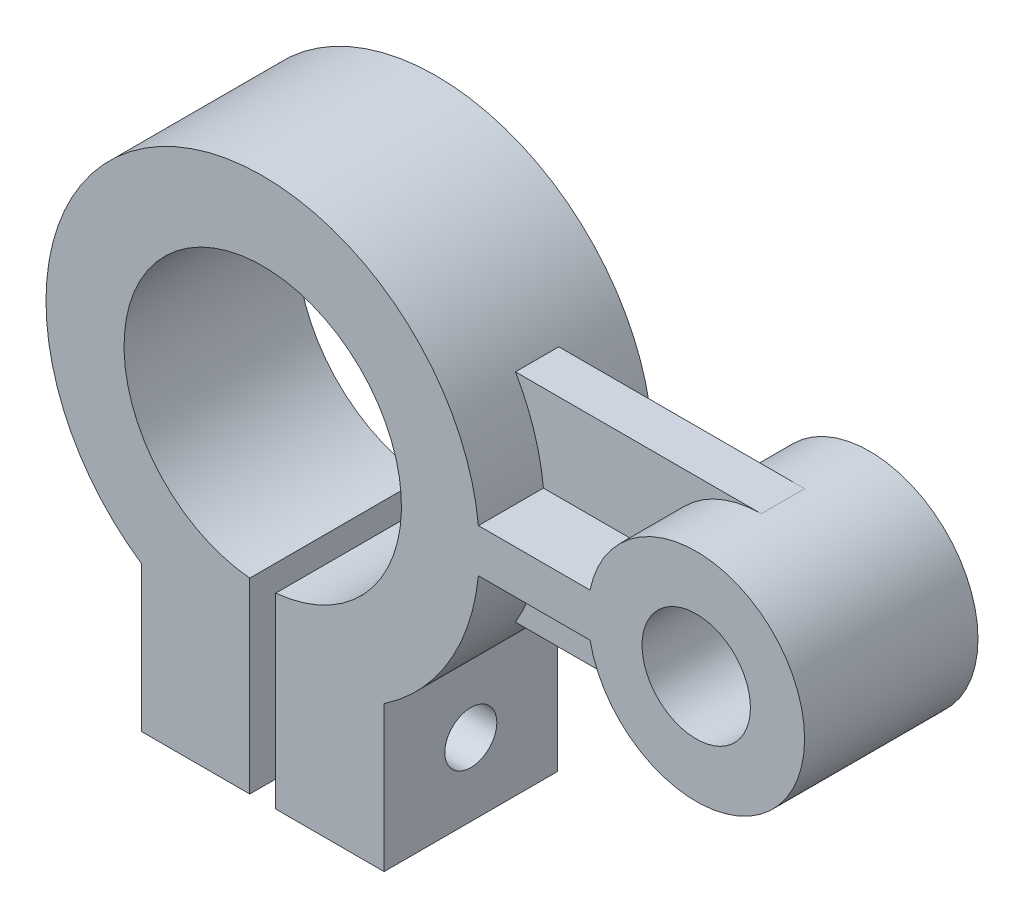
ISO-10303-21;
HEADER;
FILE_DESCRIPTION(('STEP AP214'),'2;1');
FILE_NAME('part.step','',(''),(''),'','','');
FILE_SCHEMA(('AUTOMOTIVE_DESIGN { 1 0 10303 214 1 1 1 1 }'));
ENDSEC;
DATA;
#1=APPLICATION_CONTEXT('core data for automotive mechanical design processes');
#2=APPLICATION_PROTOCOL_DEFINITION('international standard','automotive_design',2000,#1);
#3=PRODUCT_CONTEXT('',#1,'mechanical');
#4=PRODUCT('Part','Part','',(#3));
#5=PRODUCT_RELATED_PRODUCT_CATEGORY('part','',(#4));
#6=PRODUCT_DEFINITION_FORMATION('','',#4);
#7=PRODUCT_DEFINITION_CONTEXT('part definition',#1,'design');
#8=PRODUCT_DEFINITION('design','',#6,#7);
#9=PRODUCT_DEFINITION_SHAPE('','',#8);
#10=(LENGTH_UNIT() NAMED_UNIT(*) SI_UNIT(.MILLI.,.METRE.));
#11=(NAMED_UNIT(*) PLANE_ANGLE_UNIT() SI_UNIT($,.RADIAN.));
#12=(NAMED_UNIT(*) SI_UNIT($,.STERADIAN.) SOLID_ANGLE_UNIT());
#13=UNCERTAINTY_MEASURE_WITH_UNIT(LENGTH_MEASURE(1.E-05),#10,'distance_accuracy_value','');
#14=(GEOMETRIC_REPRESENTATION_CONTEXT(3) GLOBAL_UNCERTAINTY_ASSIGNED_CONTEXT((#13)) GLOBAL_UNIT_ASSIGNED_CONTEXT((#10,
#11,#12)) REPRESENTATION_CONTEXT('',''));
#15=CARTESIAN_POINT('',(0.,0.,0.));
#16=DIRECTION('',(0.,0.,1.));
#17=DIRECTION('',(1.,0.,0.));
#18=AXIS2_PLACEMENT_3D('',#15,#16,#17);
#19=CARTESIAN_POINT('',(-15.6317467532963,30.4345278718711,20.));
#20=DIRECTION('',(0.,1.,0.));
#21=DIRECTION('',(0.,0.,1.));
#22=AXIS2_PLACEMENT_3D('',#19,#20,#21);
#23=PLANE('',#22);
#24=DIRECTION('',(1.,0.,0.));
#25=VECTOR('',#24,1.);
#26=CARTESIAN_POINT('',(0.,30.4345278718711,-5.));
#27=LINE('',#26,#25);
#28=CARTESIAN_POINT('',(-15.6317467532963,30.4345278718711,-5.));
#29=VERTEX_POINT('',#28);
#30=CARTESIAN_POINT('',(10.1239839635409,30.4345278718711,-5.));
#31=VERTEX_POINT('',#30);
#32=EDGE_CURVE('E172',#29,#31,#27,.T.);
#33=ORIENTED_EDGE('',*,*,#32,.F.);
#34=DIRECTION('',(0.,0.,-1.));
#35=VECTOR('',#34,1.);
#36=CARTESIAN_POINT('',(-15.6317467532963,30.4345278718711,20.));
#37=LINE('',#36,#35);
#38=CARTESIAN_POINT('',(-15.6317467532963,30.4345278718711,-20.));
#39=VERTEX_POINT('',#38);
#40=EDGE_CURVE('E315',#29,#39,#37,.T.);
#41=ORIENTED_EDGE('',*,*,#40,.T.);
#42=DIRECTION('',(1.,0.,0.));
#43=VECTOR('',#42,1.);
#44=CARTESIAN_POINT('',(-15.6317467532963,30.4345278718711,-20.));
#45=LINE('',#44,#43);
#46=CARTESIAN_POINT('',(10.1239839635409,30.4345278718711,-20.));
#47=VERTEX_POINT('',#46);
#48=EDGE_CURVE('E175',#39,#47,#45,.T.);
#49=ORIENTED_EDGE('',*,*,#48,.T.);
#50=DIRECTION('',(0.,0.,-1.));
#51=VECTOR('',#50,1.);
#52=CARTESIAN_POINT('',(10.1239839635409,30.4345278718711,20.));
#53=LINE('',#52,#51);
#54=EDGE_CURVE('E170',#31,#47,#53,.T.);
#55=ORIENTED_EDGE('',*,*,#54,.F.);
#56=EDGE_LOOP('',(#33,#41,#49,#55));
#57=FACE_BOUND('',#56,.T.);
#58=ADVANCED_FACE('F34',(#57),#23,.F.);
#59=CARTESIAN_POINT('',(34.6188813913727,35.4345278718711,20.));
#60=DIRECTION('',(0.,0.,-1.));
#61=DIRECTION('',(-1.,0.,0.));
#62=AXIS2_PLACEMENT_3D('',#59,#60,#61);
#63=CYLINDRICAL_SURFACE('',#62,25.);
#64=CARTESIAN_POINT('',(10.1239839635409,30.4345278718711,20.));
#65=VERTEX_POINT('',#64);
#66=CARTESIAN_POINT('',(10.1239839635409,30.4345278718711,5.));
#67=VERTEX_POINT('',#66);
#68=EDGE_CURVE('E178',#65,#67,#53,.T.);
#69=ORIENTED_EDGE('',*,*,#68,.T.);
#70=CARTESIAN_POINT('',(34.6188813913727,35.4345278718711,5.));
#71=DIRECTION('',(0.,0.,1.));
#72=DIRECTION('',(1.,0.,0.));
#73=AXIS2_PLACEMENT_3D('',#70,#71,#72);
#74=CIRCLE('',#73,25.);
#75=CARTESIAN_POINT('',(34.6188813913727,10.4345278718711,5.));
#76=VERTEX_POINT('',#75);
#77=EDGE_CURVE('E49',#67,#76,#74,.T.);
#78=ORIENTED_EDGE('',*,*,#77,.T.);
#79=DIRECTION('',(0.,0.,-1.));
#80=VECTOR('',#79,1.);
#81=CARTESIAN_POINT('',(34.6188813913726,10.4345278718711,5.));
#82=LINE('',#81,#80);
#83=CARTESIAN_POINT('',(34.6188813913726,10.4345278718711,-5.));
#84=VERTEX_POINT('',#83);
#85=EDGE_CURVE('E53',#76,#84,#82,.T.);
#86=ORIENTED_EDGE('',*,*,#85,.T.);
#87=CARTESIAN_POINT('',(34.6188813913727,35.4345278718711,-5.));
#88=DIRECTION('',(0.,0.,1.));
#89=DIRECTION('',(1.,0.,0.));
#90=AXIS2_PLACEMENT_3D('',#87,#88,#89);
#91=CIRCLE('',#90,25.);
#92=EDGE_CURVE('E182',#31,#84,#91,.T.);
#93=ORIENTED_EDGE('',*,*,#92,.F.);
#94=ORIENTED_EDGE('',*,*,#54,.T.);
#95=CARTESIAN_POINT('',(34.6188813913727,35.4345278718711,-20.));
#96=DIRECTION('',(0.,0.,1.));
#97=DIRECTION('',(1.,0.,0.));
#98=AXIS2_PLACEMENT_3D('',#95,#96,#97);
#99=CIRCLE('',#98,25.);
#100=CARTESIAN_POINT('',(10.1239839635409,40.4345278718711,-20.));
#101=VERTEX_POINT('',#100);
#102=EDGE_CURVE('E295',#47,#101,#99,.T.);
#103=ORIENTED_EDGE('',*,*,#102,.T.);
#104=DIRECTION('',(0.,0.,-1.));
#105=VECTOR('',#104,1.);
#106=CARTESIAN_POINT('',(10.1239839635409,40.4345278718711,20.));
#107=LINE('',#106,#105);
#108=CARTESIAN_POINT('',(10.1239839635409,40.4345278718711,-5.));
#109=VERTEX_POINT('',#108);
#110=EDGE_CURVE('E312',#109,#101,#107,.T.);
#111=ORIENTED_EDGE('',*,*,#110,.F.);
#112=CARTESIAN_POINT('',(34.6188813913727,35.4345278718711,-5.));
#113=DIRECTION('',(0.,0.,1.));
#114=DIRECTION('',(1.,0.,0.));
#115=AXIS2_PLACEMENT_3D('',#112,#113,#114);
#116=CIRCLE('',#115,25.);
#117=CARTESIAN_POINT('',(34.6188813913726,60.4345278718711,-5.));
#118=VERTEX_POINT('',#117);
#119=EDGE_CURVE('E222',#118,#109,#116,.T.);
#120=ORIENTED_EDGE('',*,*,#119,.F.);
#121=DIRECTION('',(0.,0.,1.));
#122=VECTOR('',#121,1.);
#123=CARTESIAN_POINT('',(34.6188813913726,60.4345278718711,-5.));
#124=LINE('',#123,#122);
#125=CARTESIAN_POINT('',(34.6188813913726,60.4345278718711,5.));
#126=VERTEX_POINT('',#125);
#127=EDGE_CURVE('E227',#118,#126,#124,.T.);
#128=ORIENTED_EDGE('',*,*,#127,.T.);
#129=CARTESIAN_POINT('',(34.6188813913727,35.4345278718711,5.));
#130=DIRECTION('',(0.,0.,1.));
#131=DIRECTION('',(1.,0.,0.));
#132=AXIS2_PLACEMENT_3D('',#129,#130,#131);
#133=CIRCLE('',#132,25.);
#134=CARTESIAN_POINT('',(10.1239839635409,40.4345278718711,5.));
#135=VERTEX_POINT('',#134);
#136=EDGE_CURVE('E213',#126,#135,#133,.T.);
#137=ORIENTED_EDGE('',*,*,#136,.T.);
#138=CARTESIAN_POINT('',(10.1239839635409,40.4345278718711,20.));
#139=VERTEX_POINT('',#138);
#140=EDGE_CURVE('E179',#139,#135,#107,.T.);
#141=ORIENTED_EDGE('',*,*,#140,.F.);
#142=CARTESIAN_POINT('',(34.6188813913727,35.4345278718711,20.));
#143=DIRECTION('',(0.,0.,1.));
#144=DIRECTION('',(1.,0.,0.));
#145=AXIS2_PLACEMENT_3D('',#142,#143,#144);
#146=CIRCLE('',#145,25.);
#147=EDGE_CURVE('E270',#65,#139,#146,.T.);
#148=ORIENTED_EDGE('',*,*,#147,.F.);
#149=EDGE_LOOP('',(#69,#78,#86,#93,#94,#103,#111,#120,#128,#137,#141,#148));
#150=FACE_BOUND('',#149,.T.);
#151=ADVANCED_FACE('F183',(#150),#63,.T.);
#152=CARTESIAN_POINT('',(-15.6317467532963,40.4345278718711,20.));
#153=DIRECTION('',(0.,-1.,0.));
#154=DIRECTION('',(0.,0.,-1.));
#155=AXIS2_PLACEMENT_3D('',#152,#153,#154);
#156=PLANE('',#155);
#157=DIRECTION('',(-1.,0.,0.));
#158=VECTOR('',#157,1.);
#159=CARTESIAN_POINT('',(0.,40.4345278718711,-5.));
#160=LINE('',#159,#158);
#161=CARTESIAN_POINT('',(-15.6317467532963,40.4345278718711,-5.));
#162=VERTEX_POINT('',#161);
#163=EDGE_CURVE('E220',#109,#162,#160,.T.);
#164=ORIENTED_EDGE('',*,*,#163,.F.);
#165=ORIENTED_EDGE('',*,*,#110,.T.);
#166=DIRECTION('',(-1.,0.,0.));
#167=VECTOR('',#166,1.);
#168=CARTESIAN_POINT('',(-15.6317467532963,40.4345278718711,-20.));
#169=LINE('',#168,#167);
#170=CARTESIAN_POINT('',(-15.6317467532963,40.4345278718711,-20.));
#171=VERTEX_POINT('',#170);
#172=EDGE_CURVE('E297',#101,#171,#169,.T.);
#173=ORIENTED_EDGE('',*,*,#172,.T.);
#174=DIRECTION('',(0.,0.,-1.));
#175=VECTOR('',#174,1.);
#176=CARTESIAN_POINT('',(-15.6317467532963,40.4345278718711,20.));
#177=LINE('',#176,#175);
#178=EDGE_CURVE('E308',#162,#171,#177,.T.);
#179=ORIENTED_EDGE('',*,*,#178,.F.);
#180=EDGE_LOOP('',(#164,#165,#173,#179));
#181=FACE_BOUND('',#180,.T.);
#182=ADVANCED_FACE('F378',(#181),#156,.F.);
#183=CARTESIAN_POINT('',(-65.3811186086273,35.4345278718711,20.));
#184=DIRECTION('',(0.,0.,-1.));
#185=DIRECTION('',(-1.,0.,0.));
#186=AXIS2_PLACEMENT_3D('',#183,#184,#185);
#187=CYLINDRICAL_SURFACE('',#186,50.);
#188=CARTESIAN_POINT('',(-65.3811186086273,35.4345278718711,-5.));
#189=DIRECTION('',(0.,0.,1.));
#190=DIRECTION('',(1.,0.,0.));
#191=AXIS2_PLACEMENT_3D('',#188,#189,#190);
#192=CIRCLE('',#191,50.);
#193=CARTESIAN_POINT('',(-22.0798484194053,60.4345278718711,-5.));
#194=VERTEX_POINT('',#193);
#195=EDGE_CURVE('E218',#162,#194,#192,.T.);
#196=ORIENTED_EDGE('',*,*,#195,.F.);
#197=ORIENTED_EDGE('',*,*,#178,.T.);
#198=CARTESIAN_POINT('',(-65.3811186086273,35.4345278718711,-20.));
#199=DIRECTION('',(0.,0.,1.));
#200=DIRECTION('',(1.,0.,0.));
#201=AXIS2_PLACEMENT_3D('',#198,#199,#200);
#202=CIRCLE('',#201,50.);
#203=CARTESIAN_POINT('',(-93.3811186086273,-5.9901024825449,-20.));
#204=VERTEX_POINT('',#203);
#205=EDGE_CURVE('E300',#171,#204,#202,.T.);
#206=ORIENTED_EDGE('',*,*,#205,.T.);
#207=DIRECTION('',(0.,0.,-1.));
#208=VECTOR('',#207,1.);
#209=CARTESIAN_POINT('',(-93.3811186086273,-5.9901024825449,20.));
#210=LINE('',#209,#208);
#211=CARTESIAN_POINT('',(-93.3811186086273,-5.9901024825449,20.));
#212=VERTEX_POINT('',#211);
#213=EDGE_CURVE('E305',#212,#204,#210,.T.);
#214=ORIENTED_EDGE('',*,*,#213,.F.);
#215=CARTESIAN_POINT('',(-65.3811186086273,35.4345278718711,20.));
#216=DIRECTION('',(0.,0.,1.));
#217=DIRECTION('',(1.,0.,0.));
#218=AXIS2_PLACEMENT_3D('',#215,#216,#217);
#219=CIRCLE('',#218,50.);
#220=CARTESIAN_POINT('',(-15.6317467532963,40.4345278718711,20.));
#221=VERTEX_POINT('',#220);
#222=EDGE_CURVE('E274',#221,#212,#219,.T.);
#223=ORIENTED_EDGE('',*,*,#222,.F.);
#224=CARTESIAN_POINT('',(-15.6317467532963,40.4345278718711,5.));
#225=VERTEX_POINT('',#224);
#226=EDGE_CURVE('E309',#221,#225,#177,.T.);
#227=ORIENTED_EDGE('',*,*,#226,.T.);
#228=CARTESIAN_POINT('',(-65.3811186086273,35.4345278718711,5.));
#229=DIRECTION('',(0.,0.,1.));
#230=DIRECTION('',(1.,0.,0.));
#231=AXIS2_PLACEMENT_3D('',#228,#229,#230);
#232=CIRCLE('',#231,50.);
#233=CARTESIAN_POINT('',(-22.0798484194053,60.4345278718711,5.));
#234=VERTEX_POINT('',#233);
#235=EDGE_CURVE('E207',#225,#234,#232,.T.);
#236=ORIENTED_EDGE('',*,*,#235,.T.);
#237=DIRECTION('',(0.,0.,1.));
#238=VECTOR('',#237,1.);
#239=CARTESIAN_POINT('',(-22.0798484194053,60.4345278718711,-5.));
#240=LINE('',#239,#238);
#241=EDGE_CURVE('E228',#194,#234,#240,.T.);
#242=ORIENTED_EDGE('',*,*,#241,.F.);
#243=EDGE_LOOP('',(#196,#197,#206,#214,#223,#227,#236,#242));
#244=FACE_BOUND('',#243,.T.);
#245=ADVANCED_FACE('F373',(#244),#187,.T.);
#246=CARTESIAN_POINT('',(-65.3811186086273,35.4345278718711,20.));
#247=DIRECTION('',(0.,0.,1.));
#248=DIRECTION('',(1.,0.,0.));
#249=AXIS2_PLACEMENT_3D('',#246,#247,#248);
#250=PLANE('',#249);
#251=DIRECTION('',(1.,0.,0.));
#252=VECTOR('',#251,1.);
#253=CARTESIAN_POINT('',(-68.3811186086273,-39.5654721281289,20.));
#254=LINE('',#253,#252);
#255=CARTESIAN_POINT('',(-93.3811186086273,-39.5654721281289,20.));
#256=VERTEX_POINT('',#255);
#257=CARTESIAN_POINT('',(-68.3811186086273,-39.5654721281289,20.));
#258=VERTEX_POINT('',#257);
#259=EDGE_CURVE('E252',#256,#258,#254,.T.);
#260=ORIENTED_EDGE('',*,*,#259,.T.);
#261=DIRECTION('',(0.,1.,0.));
#262=VECTOR('',#261,1.);
#263=CARTESIAN_POINT('',(-68.3811186086273,-39.5654721281289,20.));
#264=LINE('',#263,#262);
#265=CARTESIAN_POINT('',(-68.3811186086273,3.57546322772308,20.));
#266=VERTEX_POINT('',#265);
#267=EDGE_CURVE('E255',#258,#266,#264,.T.);
#268=ORIENTED_EDGE('',*,*,#267,.T.);
#269=CARTESIAN_POINT('',(-65.3811186086273,35.4345278718711,20.));
#270=DIRECTION('',(0.,0.,-1.));
#271=DIRECTION('',(1.,0.,0.));
#272=AXIS2_PLACEMENT_3D('',#269,#270,#271);
#273=CIRCLE('',#272,32.);
#274=CARTESIAN_POINT('',(-62.3811186086273,3.57546322772308,20.));
#275=VERTEX_POINT('',#274);
#276=EDGE_CURVE('E258',#266,#275,#273,.T.);
#277=ORIENTED_EDGE('',*,*,#276,.T.);
#278=DIRECTION('',(0.,-1.,0.));
#279=VECTOR('',#278,1.);
#280=CARTESIAN_POINT('',(-62.3811186086273,-39.5654721281289,20.));
#281=LINE('',#280,#279);
#282=CARTESIAN_POINT('',(-62.3811186086273,-39.5654721281289,20.));
#283=VERTEX_POINT('',#282);
#284=EDGE_CURVE('E260',#275,#283,#281,.T.);
#285=ORIENTED_EDGE('',*,*,#284,.T.);
#286=DIRECTION('',(1.,0.,0.));
#287=VECTOR('',#286,1.);
#288=CARTESIAN_POINT('',(-62.3811186086273,-39.5654721281289,20.));
#289=LINE('',#288,#287);
#290=CARTESIAN_POINT('',(-37.3811186086273,-39.5654721281289,20.));
#291=VERTEX_POINT('',#290);
#292=EDGE_CURVE('E262',#283,#291,#289,.T.);
#293=ORIENTED_EDGE('',*,*,#292,.T.);
#294=DIRECTION('',(0.,1.,0.));
#295=VECTOR('',#294,1.);
#296=CARTESIAN_POINT('',(-37.3811186086273,-39.5654721281289,20.));
#297=LINE('',#296,#295);
#298=CARTESIAN_POINT('',(-37.3811186086273,-5.99010248254489,20.));
#299=VERTEX_POINT('',#298);
#300=EDGE_CURVE('E264',#291,#299,#297,.T.);
#301=ORIENTED_EDGE('',*,*,#300,.T.);
#302=CARTESIAN_POINT('',(-65.3811186086273,35.4345278718711,20.));
#303=DIRECTION('',(0.,0.,1.));
#304=DIRECTION('',(1.,0.,0.));
#305=AXIS2_PLACEMENT_3D('',#302,#303,#304);
#306=CIRCLE('',#305,50.);
#307=CARTESIAN_POINT('',(-15.6317467532963,30.4345278718711,20.));
#308=VERTEX_POINT('',#307);
#309=EDGE_CURVE('E266',#299,#308,#306,.T.);
#310=ORIENTED_EDGE('',*,*,#309,.T.);
#311=DIRECTION('',(1.,0.,0.));
#312=VECTOR('',#311,1.);
#313=CARTESIAN_POINT('',(-15.6317467532963,30.4345278718711,20.));
#314=LINE('',#313,#312);
#315=EDGE_CURVE('E268',#308,#65,#314,.T.);
#316=ORIENTED_EDGE('',*,*,#315,.T.);
#317=ORIENTED_EDGE('',*,*,#147,.T.);
#318=DIRECTION('',(-1.,0.,0.));
#319=VECTOR('',#318,1.);
#320=CARTESIAN_POINT('',(-15.6317467532963,40.4345278718711,20.));
#321=LINE('',#320,#319);
#322=EDGE_CURVE('E272',#139,#221,#321,.T.);
#323=ORIENTED_EDGE('',*,*,#322,.T.);
#324=ORIENTED_EDGE('',*,*,#222,.T.);
#325=DIRECTION('',(0.,-1.,0.));
#326=VECTOR('',#325,1.);
#327=CARTESIAN_POINT('',(-93.3811186086273,-39.5654721281289,20.));
#328=LINE('',#327,#326);
#329=EDGE_CURVE('E276',#212,#256,#328,.T.);
#330=ORIENTED_EDGE('',*,*,#329,.T.);
#331=EDGE_LOOP('',(#260,#268,#277,#285,#293,#301,#310,#316,#317,#323,#324,#330));
#332=FACE_BOUND('',#331,.T.);
#333=CARTESIAN_POINT('',(34.6188813913727,35.4345278718711,20.));
#334=DIRECTION('',(0.,0.,1.));
#335=DIRECTION('',(1.,0.,0.));
#336=AXIS2_PLACEMENT_3D('',#333,#334,#335);
#337=CIRCLE('',#336,12.5);
#338=CARTESIAN_POINT('',(47.1188813913727,35.4345278718711,20.));
#339=VERTEX_POINT('',#338);
#340=EDGE_CURVE('E246',#339,#339,#337,.T.);
#341=ORIENTED_EDGE('',*,*,#340,.F.);
#342=EDGE_LOOP('',(#341));
#343=FACE_BOUND('',#342,.T.);
#344=ADVANCED_FACE('F355',(#332,#343),#250,.T.);
#345=CARTESIAN_POINT('',(-65.3811186086273,35.4345278718711,-20.));
#346=DIRECTION('',(0.,0.,1.));
#347=DIRECTION('',(1.,0.,0.));
#348=AXIS2_PLACEMENT_3D('',#345,#346,#347);
#349=PLANE('',#348);
#350=DIRECTION('',(1.,0.,0.));
#351=VECTOR('',#350,1.);
#352=CARTESIAN_POINT('',(-68.3811186086273,-39.5654721281289,-20.));
#353=LINE('',#352,#351);
#354=CARTESIAN_POINT('',(-93.3811186086273,-39.5654721281289,-20.));
#355=VERTEX_POINT('',#354);
#356=CARTESIAN_POINT('',(-68.3811186086273,-39.5654721281289,-20.));
#357=VERTEX_POINT('',#356);
#358=EDGE_CURVE('E249',#355,#357,#353,.T.);
#359=ORIENTED_EDGE('',*,*,#358,.F.);
#360=DIRECTION('',(0.,-1.,0.));
#361=VECTOR('',#360,1.);
#362=CARTESIAN_POINT('',(-93.3811186086273,-39.5654721281289,-20.));
#363=LINE('',#362,#361);
#364=EDGE_CURVE('E256',#204,#355,#363,.T.);
#365=ORIENTED_EDGE('',*,*,#364,.F.);
#366=ORIENTED_EDGE('',*,*,#205,.F.);
#367=ORIENTED_EDGE('',*,*,#172,.F.);
#368=ORIENTED_EDGE('',*,*,#102,.F.);
#369=ORIENTED_EDGE('',*,*,#48,.F.);
#370=CARTESIAN_POINT('',(-65.3811186086273,35.4345278718711,-20.));
#371=DIRECTION('',(0.,0.,1.));
#372=DIRECTION('',(1.,0.,0.));
#373=AXIS2_PLACEMENT_3D('',#370,#371,#372);
#374=CIRCLE('',#373,50.);
#375=CARTESIAN_POINT('',(-37.3811186086273,-5.99010248254489,-20.));
#376=VERTEX_POINT('',#375);
#377=EDGE_CURVE('E291',#376,#39,#374,.T.);
#378=ORIENTED_EDGE('',*,*,#377,.F.);
#379=DIRECTION('',(0.,1.,0.));
#380=VECTOR('',#379,1.);
#381=CARTESIAN_POINT('',(-37.3811186086273,-39.5654721281289,-20.));
#382=LINE('',#381,#380);
#383=CARTESIAN_POINT('',(-37.3811186086273,-39.5654721281289,-20.));
#384=VERTEX_POINT('',#383);
#385=EDGE_CURVE('E289',#384,#376,#382,.T.);
#386=ORIENTED_EDGE('',*,*,#385,.F.);
#387=DIRECTION('',(1.,0.,0.));
#388=VECTOR('',#387,1.);
#389=CARTESIAN_POINT('',(-62.3811186086273,-39.5654721281289,-20.));
#390=LINE('',#389,#388);
#391=CARTESIAN_POINT('',(-62.3811186086273,-39.5654721281289,-20.));
#392=VERTEX_POINT('',#391);
#393=EDGE_CURVE('E287',#392,#384,#390,.T.);
#394=ORIENTED_EDGE('',*,*,#393,.F.);
#395=DIRECTION('',(0.,-1.,0.));
#396=VECTOR('',#395,1.);
#397=CARTESIAN_POINT('',(-62.3811186086273,-39.5654721281289,-20.));
#398=LINE('',#397,#396);
#399=CARTESIAN_POINT('',(-62.3811186086273,3.57546322772308,-20.));
#400=VERTEX_POINT('',#399);
#401=EDGE_CURVE('E285',#400,#392,#398,.T.);
#402=ORIENTED_EDGE('',*,*,#401,.F.);
#403=CARTESIAN_POINT('',(-65.3811186086273,35.4345278718711,-20.));
#404=DIRECTION('',(0.,0.,-1.));
#405=DIRECTION('',(1.,0.,0.));
#406=AXIS2_PLACEMENT_3D('',#403,#404,#405);
#407=CIRCLE('',#406,32.);
#408=CARTESIAN_POINT('',(-68.3811186086273,3.57546322772308,-20.));
#409=VERTEX_POINT('',#408);
#410=EDGE_CURVE('E283',#409,#400,#407,.T.);
#411=ORIENTED_EDGE('',*,*,#410,.F.);
#412=DIRECTION('',(0.,1.,0.));
#413=VECTOR('',#412,1.);
#414=CARTESIAN_POINT('',(-68.3811186086273,-39.5654721281289,-20.));
#415=LINE('',#414,#413);
#416=EDGE_CURVE('E281',#357,#409,#415,.T.);
#417=ORIENTED_EDGE('',*,*,#416,.F.);
#418=EDGE_LOOP('',(#359,#365,#366,#367,#368,#369,#378,#386,#394,#402,#411,#417));
#419=FACE_BOUND('',#418,.T.);
#420=CARTESIAN_POINT('',(34.6188813913727,35.4345278718711,-20.));
#421=DIRECTION('',(0.,0.,1.));
#422=DIRECTION('',(1.,0.,0.));
#423=AXIS2_PLACEMENT_3D('',#420,#421,#422);
#424=CIRCLE('',#423,12.5);
#425=CARTESIAN_POINT('',(47.1188813913727,35.4345278718711,-20.));
#426=VERTEX_POINT('',#425);
#427=EDGE_CURVE('E245',#426,#426,#424,.T.);
#428=ORIENTED_EDGE('',*,*,#427,.T.);
#429=EDGE_LOOP('',(#428));
#430=FACE_BOUND('',#429,.T.);
#431=ADVANCED_FACE('F341',(#419,#430),#349,.F.);
#432=CARTESIAN_POINT('',(-68.3811186086273,-39.5654721281289,20.));
#433=DIRECTION('',(0.,1.,0.));
#434=DIRECTION('',(0.,0.,1.));
#435=AXIS2_PLACEMENT_3D('',#432,#433,#434);
#436=PLANE('',#435);
#437=ORIENTED_EDGE('',*,*,#358,.T.);
#438=DIRECTION('',(0.,0.,-1.));
#439=VECTOR('',#438,1.);
#440=CARTESIAN_POINT('',(-68.3811186086273,-39.5654721281289,20.));
#441=LINE('',#440,#439);
#442=EDGE_CURVE('E11',#258,#357,#441,.T.);
#443=ORIENTED_EDGE('',*,*,#442,.F.);
#444=ORIENTED_EDGE('',*,*,#259,.F.);
#445=DIRECTION('',(0.,0.,-1.));
#446=VECTOR('',#445,1.);
#447=CARTESIAN_POINT('',(-93.3811186086273,-39.5654721281289,20.));
#448=LINE('',#447,#446);
#449=EDGE_CURVE('E278',#256,#355,#448,.T.);
#450=ORIENTED_EDGE('',*,*,#449,.T.);
#451=EDGE_LOOP('',(#437,#443,#444,#450));
#452=FACE_BOUND('',#451,.T.);
#453=ADVANCED_FACE('F36',(#452),#436,.F.);
#454=CARTESIAN_POINT('',(-68.3811186086273,-39.5654721281289,20.));
#455=DIRECTION('',(-1.,0.,0.));
#456=DIRECTION('',(0.,0.,1.));
#457=AXIS2_PLACEMENT_3D('',#454,#455,#456);
#458=PLANE('',#457);
#459=CARTESIAN_POINT('',(-68.3811186086273,-22.7777873053369,0.));
#460=DIRECTION('',(-1.,0.,0.));
#461=DIRECTION('',(0.,0.,1.));
#462=AXIS2_PLACEMENT_3D('',#459,#460,#461);
#463=CIRCLE('',#462,6.);
#464=CARTESIAN_POINT('',(-68.3811186086273,-22.7777873053369,6.));
#465=VERTEX_POINT('',#464);
#466=EDGE_CURVE('E242',#465,#465,#463,.T.);
#467=ORIENTED_EDGE('',*,*,#466,.T.);
#468=EDGE_LOOP('',(#467));
#469=FACE_BOUND('',#468,.T.);
#470=ORIENTED_EDGE('',*,*,#416,.T.);
#471=DIRECTION('',(0.,0.,-1.));
#472=VECTOR('',#471,1.);
#473=CARTESIAN_POINT('',(-68.3811186086273,3.57546322772308,20.));
#474=LINE('',#473,#472);
#475=EDGE_CURVE('E42',#266,#409,#474,.T.);
#476=ORIENTED_EDGE('',*,*,#475,.F.);
#477=ORIENTED_EDGE('',*,*,#267,.F.);
#478=ORIENTED_EDGE('',*,*,#442,.T.);
#479=EDGE_LOOP('',(#470,#476,#477,#478));
#480=FACE_BOUND('',#479,.T.);
#481=ADVANCED_FACE('F360',(#469,#480),#458,.F.);
#482=CARTESIAN_POINT('',(-65.3811186086273,35.4345278718711,20.));
#483=DIRECTION('',(0.,0.,-1.));
#484=DIRECTION('',(-1.,0.,0.));
#485=AXIS2_PLACEMENT_3D('',#482,#483,#484);
#486=CYLINDRICAL_SURFACE('',#485,32.);
#487=ORIENTED_EDGE('',*,*,#410,.T.);
#488=DIRECTION('',(0.,0.,-1.));
#489=VECTOR('',#488,1.);
#490=CARTESIAN_POINT('',(-62.3811186086273,3.57546322772308,20.));
#491=LINE('',#490,#489);
#492=EDGE_CURVE('E328',#275,#400,#491,.T.);
#493=ORIENTED_EDGE('',*,*,#492,.F.);
#494=ORIENTED_EDGE('',*,*,#276,.F.);
#495=ORIENTED_EDGE('',*,*,#475,.T.);
#496=EDGE_LOOP('',(#487,#493,#494,#495));
#497=FACE_BOUND('',#496,.T.);
#498=ADVANCED_FACE('F335',(#497),#486,.F.);
#499=CARTESIAN_POINT('',(-62.3811186086273,-39.5654721281289,20.));
#500=DIRECTION('',(1.,0.,0.));
#501=DIRECTION('',(0.,0.,-1.));
#502=AXIS2_PLACEMENT_3D('',#499,#500,#501);
#503=PLANE('',#502);
#504=CARTESIAN_POINT('',(-62.3811186086273,-22.7777873053369,0.));
#505=DIRECTION('',(1.,0.,0.));
#506=DIRECTION('',(0.,0.,-1.));
#507=AXIS2_PLACEMENT_3D('',#504,#505,#506);
#508=CIRCLE('',#507,6.);
#509=CARTESIAN_POINT('',(-62.3811186086273,-22.7777873053369,-6.));
#510=VERTEX_POINT('',#509);
#511=EDGE_CURVE('E237',#510,#510,#508,.T.);
#512=ORIENTED_EDGE('',*,*,#511,.T.);
#513=EDGE_LOOP('',(#512));
#514=FACE_BOUND('',#513,.T.);
#515=ORIENTED_EDGE('',*,*,#401,.T.);
#516=DIRECTION('',(0.,0.,-1.));
#517=VECTOR('',#516,1.);
#518=CARTESIAN_POINT('',(-62.3811186086273,-39.5654721281289,20.));
#519=LINE('',#518,#517);
#520=EDGE_CURVE('E325',#283,#392,#519,.T.);
#521=ORIENTED_EDGE('',*,*,#520,.F.);
#522=ORIENTED_EDGE('',*,*,#284,.F.);
#523=ORIENTED_EDGE('',*,*,#492,.T.);
#524=EDGE_LOOP('',(#515,#521,#522,#523));
#525=FACE_BOUND('',#524,.T.);
#526=ADVANCED_FACE('F347',(#514,#525),#503,.F.);
#527=CARTESIAN_POINT('',(-62.3811186086273,-39.5654721281289,20.));
#528=DIRECTION('',(0.,1.,0.));
#529=DIRECTION('',(0.,0.,1.));
#530=AXIS2_PLACEMENT_3D('',#527,#528,#529);
#531=PLANE('',#530);
#532=ORIENTED_EDGE('',*,*,#393,.T.);
#533=DIRECTION('',(0.,0.,-1.));
#534=VECTOR('',#533,1.);
#535=CARTESIAN_POINT('',(-37.3811186086273,-39.5654721281289,20.));
#536=LINE('',#535,#534);
#537=EDGE_CURVE('E322',#291,#384,#536,.T.);
#538=ORIENTED_EDGE('',*,*,#537,.F.);
#539=ORIENTED_EDGE('',*,*,#292,.F.);
#540=ORIENTED_EDGE('',*,*,#520,.T.);
#541=EDGE_LOOP('',(#532,#538,#539,#540));
#542=FACE_BOUND('',#541,.T.);
#543=ADVANCED_FACE('F351',(#542),#531,.F.);
#544=CARTESIAN_POINT('',(-37.3811186086273,-39.5654721281289,20.));
#545=DIRECTION('',(-1.,0.,0.));
#546=DIRECTION('',(0.,0.,1.));
#547=AXIS2_PLACEMENT_3D('',#544,#545,#546);
#548=PLANE('',#547);
#549=CARTESIAN_POINT('',(-37.3811186086273,-22.7777873053369,0.));
#550=DIRECTION('',(1.,0.,0.));
#551=DIRECTION('',(0.,0.,-1.));
#552=AXIS2_PLACEMENT_3D('',#549,#550,#551);
#553=CIRCLE('',#552,6.);
#554=CARTESIAN_POINT('',(-37.3811186086273,-22.7777873053369,-6.));
#555=VERTEX_POINT('',#554);
#556=EDGE_CURVE('E231',#555,#555,#553,.T.);
#557=ORIENTED_EDGE('',*,*,#556,.F.);
#558=EDGE_LOOP('',(#557));
#559=FACE_BOUND('',#558,.T.);
#560=ORIENTED_EDGE('',*,*,#385,.T.);
#561=DIRECTION('',(0.,0.,-1.));
#562=VECTOR('',#561,1.);
#563=CARTESIAN_POINT('',(-37.3811186086273,-5.99010248254489,20.));
#564=LINE('',#563,#562);
#565=EDGE_CURVE('E319',#299,#376,#564,.T.);
#566=ORIENTED_EDGE('',*,*,#565,.F.);
#567=ORIENTED_EDGE('',*,*,#300,.F.);
#568=ORIENTED_EDGE('',*,*,#537,.T.);
#569=EDGE_LOOP('',(#560,#566,#567,#568));
#570=FACE_BOUND('',#569,.T.);
#571=ADVANCED_FACE('F412',(#559,#570),#548,.F.);
#572=CARTESIAN_POINT('',(-65.3811186086273,35.4345278718711,20.));
#573=DIRECTION('',(0.,0.,-1.));
#574=DIRECTION('',(-1.,0.,0.));
#575=AXIS2_PLACEMENT_3D('',#572,#573,#574);
#576=CYLINDRICAL_SURFACE('',#575,50.);
#577=DIRECTION('',(0.,0.,-1.));
#578=VECTOR('',#577,1.);
#579=CARTESIAN_POINT('',(-22.0798484194053,10.4345278718711,5.));
#580=LINE('',#579,#578);
#581=CARTESIAN_POINT('',(-22.0798484194053,10.4345278718711,5.));
#582=VERTEX_POINT('',#581);
#583=CARTESIAN_POINT('',(-22.0798484194053,10.4345278718711,-5.));
#584=VERTEX_POINT('',#583);
#585=EDGE_CURVE('E204',#582,#584,#580,.T.);
#586=ORIENTED_EDGE('',*,*,#585,.F.);
#587=CARTESIAN_POINT('',(-65.3811186086273,35.4345278718711,5.));
#588=DIRECTION('',(0.,0.,1.));
#589=DIRECTION('',(1.,0.,0.));
#590=AXIS2_PLACEMENT_3D('',#587,#588,#589);
#591=CIRCLE('',#590,50.);
#592=CARTESIAN_POINT('',(-15.6317467532963,30.4345278718711,5.));
#593=VERTEX_POINT('',#592);
#594=EDGE_CURVE('E198',#582,#593,#591,.T.);
#595=ORIENTED_EDGE('',*,*,#594,.T.);
#596=EDGE_CURVE('E316',#308,#593,#37,.T.);
#597=ORIENTED_EDGE('',*,*,#596,.F.);
#598=ORIENTED_EDGE('',*,*,#309,.F.);
#599=ORIENTED_EDGE('',*,*,#565,.T.);
#600=ORIENTED_EDGE('',*,*,#377,.T.);
#601=ORIENTED_EDGE('',*,*,#40,.F.);
#602=CARTESIAN_POINT('',(-65.3811186086273,35.4345278718711,-5.));
#603=DIRECTION('',(0.,0.,1.));
#604=DIRECTION('',(1.,0.,0.));
#605=AXIS2_PLACEMENT_3D('',#602,#603,#604);
#606=CIRCLE('',#605,50.);
#607=EDGE_CURVE('E189',#584,#29,#606,.T.);
#608=ORIENTED_EDGE('',*,*,#607,.F.);
#609=EDGE_LOOP('',(#586,#595,#597,#598,#599,#600,#601,#608));
#610=FACE_BOUND('',#609,.T.);
#611=ADVANCED_FACE('F410',(#610),#576,.T.);
#612=ORIENTED_EDGE('',*,*,#596,.T.);
#613=DIRECTION('',(1.,0.,0.));
#614=VECTOR('',#613,1.);
#615=CARTESIAN_POINT('',(0.,30.4345278718711,5.));
#616=LINE('',#615,#614);
#617=EDGE_CURVE('E196',#593,#67,#616,.T.);
#618=ORIENTED_EDGE('',*,*,#617,.T.);
#619=ORIENTED_EDGE('',*,*,#68,.F.);
#620=ORIENTED_EDGE('',*,*,#315,.F.);
#621=EDGE_LOOP('',(#612,#618,#619,#620));
#622=FACE_BOUND('',#621,.T.);
#623=ADVANCED_FACE('F401',(#622),#23,.F.);
#624=ORIENTED_EDGE('',*,*,#140,.T.);
#625=DIRECTION('',(-1.,0.,0.));
#626=VECTOR('',#625,1.);
#627=CARTESIAN_POINT('',(0.,40.4345278718711,5.));
#628=LINE('',#627,#626);
#629=EDGE_CURVE('E210',#135,#225,#628,.T.);
#630=ORIENTED_EDGE('',*,*,#629,.T.);
#631=ORIENTED_EDGE('',*,*,#226,.F.);
#632=ORIENTED_EDGE('',*,*,#322,.F.);
#633=EDGE_LOOP('',(#624,#630,#631,#632));
#634=FACE_BOUND('',#633,.T.);
#635=ADVANCED_FACE('F392',(#634),#156,.F.);
#636=CARTESIAN_POINT('',(-93.3811186086273,-39.5654721281289,20.));
#637=DIRECTION('',(1.,0.,0.));
#638=DIRECTION('',(0.,0.,-1.));
#639=AXIS2_PLACEMENT_3D('',#636,#637,#638);
#640=PLANE('',#639);
#641=CARTESIAN_POINT('',(-93.3811186086273,-22.7777873053369,0.));
#642=DIRECTION('',(1.,0.,0.));
#643=DIRECTION('',(0.,0.,-1.));
#644=AXIS2_PLACEMENT_3D('',#641,#642,#643);
#645=CIRCLE('',#644,6.);
#646=CARTESIAN_POINT('',(-93.3811186086273,-22.7777873053369,-6.));
#647=VERTEX_POINT('',#646);
#648=EDGE_CURVE('E234',#647,#647,#645,.T.);
#649=ORIENTED_EDGE('',*,*,#648,.T.);
#650=EDGE_LOOP('',(#649));
#651=FACE_BOUND('',#650,.T.);
#652=ORIENTED_EDGE('',*,*,#364,.T.);
#653=ORIENTED_EDGE('',*,*,#449,.F.);
#654=ORIENTED_EDGE('',*,*,#329,.F.);
#655=ORIENTED_EDGE('',*,*,#213,.T.);
#656=EDGE_LOOP('',(#652,#653,#654,#655));
#657=FACE_BOUND('',#656,.T.);
#658=ADVANCED_FACE('F367',(#651,#657),#640,.F.);
#659=CARTESIAN_POINT('',(34.6188813913727,35.4345278718711,20.));
#660=DIRECTION('',(0.,0.,-1.));
#661=DIRECTION('',(-1.,0.,0.));
#662=AXIS2_PLACEMENT_3D('',#659,#660,#661);
#663=CYLINDRICAL_SURFACE('',#662,12.5);
#664=ORIENTED_EDGE('',*,*,#340,.T.);
#665=EDGE_LOOP('',(#664));
#666=FACE_BOUND('',#665,.T.);
#667=ORIENTED_EDGE('',*,*,#427,.F.);
#668=EDGE_LOOP('',(#667));
#669=FACE_BOUND('',#668,.T.);
#670=ADVANCED_FACE('F437',(#666,#669),#663,.F.);
#671=CARTESIAN_POINT('',(-93.3811186086273,-22.7777873053369,0.));
#672=DIRECTION('',(1.,0.,0.));
#673=DIRECTION('',(0.,0.,-1.));
#674=AXIS2_PLACEMENT_3D('',#671,#672,#673);
#675=CYLINDRICAL_SURFACE('',#674,6.);
#676=ORIENTED_EDGE('',*,*,#648,.F.);
#677=EDGE_LOOP('',(#676));
#678=FACE_BOUND('',#677,.T.);
#679=ORIENTED_EDGE('',*,*,#466,.F.);
#680=EDGE_LOOP('',(#679));
#681=FACE_BOUND('',#680,.T.);
#682=ADVANCED_FACE('F454',(#678,#681),#675,.F.);
#683=ORIENTED_EDGE('',*,*,#556,.T.);
#684=EDGE_LOOP('',(#683));
#685=FACE_BOUND('',#684,.T.);
#686=ORIENTED_EDGE('',*,*,#511,.F.);
#687=EDGE_LOOP('',(#686));
#688=FACE_BOUND('',#687,.T.);
#689=ADVANCED_FACE('F458',(#685,#688),#675,.F.);
#690=CARTESIAN_POINT('',(0.,60.4345278718711,-5.));
#691=DIRECTION('',(0.,1.,0.));
#692=DIRECTION('',(-1.,0.,0.));
#693=AXIS2_PLACEMENT_3D('',#690,#691,#692);
#694=PLANE('',#693);
#695=DIRECTION('',(-1.,0.,0.));
#696=VECTOR('',#695,1.);
#697=CARTESIAN_POINT('',(0.,60.4345278718711,5.));
#698=LINE('',#697,#696);
#699=EDGE_CURVE('E216',#126,#234,#698,.T.);
#700=ORIENTED_EDGE('',*,*,#699,.F.);
#701=ORIENTED_EDGE('',*,*,#127,.F.);
#702=DIRECTION('',(-1.,0.,0.));
#703=VECTOR('',#702,1.);
#704=CARTESIAN_POINT('',(0.,60.4345278718711,-5.));
#705=LINE('',#704,#703);
#706=EDGE_CURVE('E224',#118,#194,#705,.T.);
#707=ORIENTED_EDGE('',*,*,#706,.T.);
#708=ORIENTED_EDGE('',*,*,#241,.T.);
#709=EDGE_LOOP('',(#700,#701,#707,#708));
#710=FACE_BOUND('',#709,.T.);
#711=ADVANCED_FACE('F386',(#710),#694,.T.);
#712=CARTESIAN_POINT('',(0.,0.,-5.));
#713=DIRECTION('',(0.,0.,1.));
#714=DIRECTION('',(1.,0.,0.));
#715=AXIS2_PLACEMENT_3D('',#712,#713,#714);
#716=PLANE('',#715);
#717=ORIENTED_EDGE('',*,*,#195,.T.);
#718=ORIENTED_EDGE('',*,*,#706,.F.);
#719=ORIENTED_EDGE('',*,*,#119,.T.);
#720=ORIENTED_EDGE('',*,*,#163,.T.);
#721=EDGE_LOOP('',(#717,#718,#719,#720));
#722=FACE_BOUND('',#721,.T.);
#723=ADVANCED_FACE('F384',(#722),#716,.F.);
#724=CARTESIAN_POINT('',(0.,0.,5.));
#725=DIRECTION('',(0.,0.,1.));
#726=DIRECTION('',(1.,0.,0.));
#727=AXIS2_PLACEMENT_3D('',#724,#725,#726);
#728=PLANE('',#727);
#729=ORIENTED_EDGE('',*,*,#235,.F.);
#730=ORIENTED_EDGE('',*,*,#629,.F.);
#731=ORIENTED_EDGE('',*,*,#136,.F.);
#732=ORIENTED_EDGE('',*,*,#699,.T.);
#733=EDGE_LOOP('',(#729,#730,#731,#732));
#734=FACE_BOUND('',#733,.T.);
#735=ADVANCED_FACE('F389',(#734),#728,.T.);
#736=CARTESIAN_POINT('',(0.,10.4345278718711,5.));
#737=DIRECTION('',(0.,-1.,0.));
#738=DIRECTION('',(0.,0.,-1.));
#739=AXIS2_PLACEMENT_3D('',#736,#737,#738);
#740=PLANE('',#739);
#741=ORIENTED_EDGE('',*,*,#585,.T.);
#742=DIRECTION('',(-1.,0.,0.));
#743=VECTOR('',#742,1.);
#744=CARTESIAN_POINT('',(0.,10.4345278718711,-5.));
#745=LINE('',#744,#743);
#746=EDGE_CURVE('E191',#84,#584,#745,.T.);
#747=ORIENTED_EDGE('',*,*,#746,.F.);
#748=ORIENTED_EDGE('',*,*,#85,.F.);
#749=DIRECTION('',(-1.,0.,0.));
#750=VECTOR('',#749,1.);
#751=CARTESIAN_POINT('',(0.,10.4345278718711,5.));
#752=LINE('',#751,#750);
#753=EDGE_CURVE('E200',#76,#582,#752,.T.);
#754=ORIENTED_EDGE('',*,*,#753,.T.);
#755=EDGE_LOOP('',(#741,#747,#748,#754));
#756=FACE_BOUND('',#755,.T.);
#757=ADVANCED_FACE('F408',(#756),#740,.T.);
#758=CARTESIAN_POINT('',(0.,0.,5.));
#759=DIRECTION('',(0.,0.,1.));
#760=DIRECTION('',(1.,0.,0.));
#761=AXIS2_PLACEMENT_3D('',#758,#759,#760);
#762=PLANE('',#761);
#763=ORIENTED_EDGE('',*,*,#77,.F.);
#764=ORIENTED_EDGE('',*,*,#617,.F.);
#765=ORIENTED_EDGE('',*,*,#594,.F.);
#766=ORIENTED_EDGE('',*,*,#753,.F.);
#767=EDGE_LOOP('',(#763,#764,#765,#766));
#768=FACE_BOUND('',#767,.T.);
#769=ADVANCED_FACE('F405',(#768),#762,.T.);
#770=CARTESIAN_POINT('',(0.,0.,-5.));
#771=DIRECTION('',(0.,0.,1.));
#772=DIRECTION('',(1.,0.,0.));
#773=AXIS2_PLACEMENT_3D('',#770,#771,#772);
#774=PLANE('',#773);
#775=ORIENTED_EDGE('',*,*,#92,.T.);
#776=ORIENTED_EDGE('',*,*,#746,.T.);
#777=ORIENTED_EDGE('',*,*,#607,.T.);
#778=ORIENTED_EDGE('',*,*,#32,.T.);
#779=EDGE_LOOP('',(#775,#776,#777,#778));
#780=FACE_BOUND('',#779,.T.);
#781=ADVANCED_FACE('F188',(#780),#774,.F.);
#782=CLOSED_SHELL('',(#58,#151,#182,#245,#344,#431,#453,#481,#498,#526,#543,#571,#611,#623,#635,
#658,#670,#682,#689,#711,#723,#735,#757,#769,#781));
#783=MANIFOLD_SOLID_BREP('B2',#782);
#784=ADVANCED_BREP_SHAPE_REPRESENTATION('',(#18,#783),#14);
#785=SHAPE_DEFINITION_REPRESENTATION(#9,#784);
ENDSEC;
END-ISO-10303-21;
